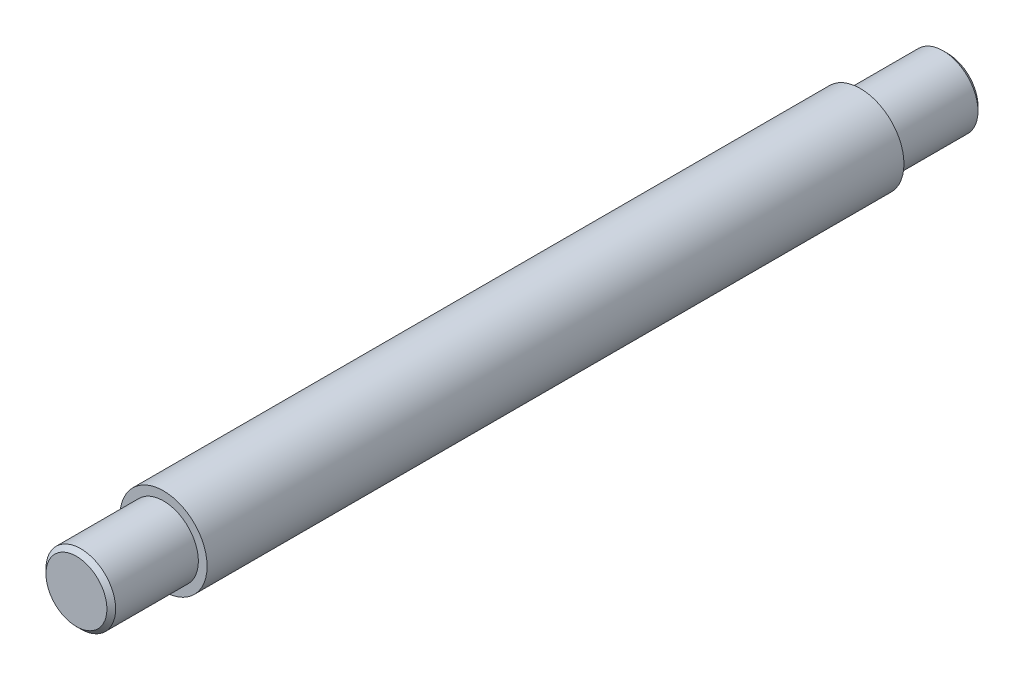
ISO-10303-21;
HEADER;
FILE_DESCRIPTION(('STEP AP214'),'2;1');
FILE_NAME('part.step','',(''),(''),'','','');
FILE_SCHEMA(('AUTOMOTIVE_DESIGN { 1 0 10303 214 1 1 1 1 }'));
ENDSEC;
DATA;
#1=APPLICATION_CONTEXT('core data for automotive mechanical design processes');
#2=APPLICATION_PROTOCOL_DEFINITION('international standard','automotive_design',2000,#1);
#3=PRODUCT_CONTEXT('',#1,'mechanical');
#4=PRODUCT('Part','Part','',(#3));
#5=PRODUCT_RELATED_PRODUCT_CATEGORY('part','',(#4));
#6=PRODUCT_DEFINITION_FORMATION('','',#4);
#7=PRODUCT_DEFINITION_CONTEXT('part definition',#1,'design');
#8=PRODUCT_DEFINITION('design','',#6,#7);
#9=PRODUCT_DEFINITION_SHAPE('','',#8);
#10=(LENGTH_UNIT() NAMED_UNIT(*) SI_UNIT(.MILLI.,.METRE.));
#11=(NAMED_UNIT(*) PLANE_ANGLE_UNIT() SI_UNIT($,.RADIAN.));
#12=(NAMED_UNIT(*) SI_UNIT($,.STERADIAN.) SOLID_ANGLE_UNIT());
#13=UNCERTAINTY_MEASURE_WITH_UNIT(LENGTH_MEASURE(1.E-05),#10,'distance_accuracy_value','');
#14=(GEOMETRIC_REPRESENTATION_CONTEXT(3) GLOBAL_UNCERTAINTY_ASSIGNED_CONTEXT((#13)) GLOBAL_UNIT_ASSIGNED_CONTEXT((#10,
#11,#12)) REPRESENTATION_CONTEXT('',''));
#15=CARTESIAN_POINT('',(0.,0.,0.));
#16=DIRECTION('',(0.,0.,1.));
#17=DIRECTION('',(1.,0.,0.));
#18=AXIS2_PLACEMENT_3D('',#15,#16,#17);
#19=CARTESIAN_POINT('',(0.,0.,10.));
#20=DIRECTION('',(0.,0.,-1.));
#21=DIRECTION('',(-1.,0.,0.));
#22=AXIS2_PLACEMENT_3D('',#19,#20,#21);
#23=CYLINDRICAL_SURFACE('',#22,4.);
#24=CARTESIAN_POINT('',(0.,0.,0.499999999999997));
#25=DIRECTION('',(0.,0.,1.));
#26=DIRECTION('',(1.,0.,0.));
#27=AXIS2_PLACEMENT_3D('',#24,#25,#26);
#28=CIRCLE('',#27,4.);
#29=CARTESIAN_POINT('',(4.,0.,0.499999999999997));
#30=VERTEX_POINT('',#29);
#31=EDGE_CURVE('E49',#30,#30,#28,.T.);
#32=ORIENTED_EDGE('',*,*,#31,.T.);
#33=EDGE_LOOP('',(#32));
#34=FACE_BOUND('',#33,.T.);
#35=CARTESIAN_POINT('',(0.,0.,10.));
#36=DIRECTION('',(0.,0.,1.));
#37=DIRECTION('',(1.,0.,0.));
#38=AXIS2_PLACEMENT_3D('',#35,#36,#37);
#39=CIRCLE('',#38,4.);
#40=CARTESIAN_POINT('',(4.,0.,10.));
#41=VERTEX_POINT('',#40);
#42=EDGE_CURVE('E54',#41,#41,#39,.T.);
#43=ORIENTED_EDGE('',*,*,#42,.F.);
#44=EDGE_LOOP('',(#43));
#45=FACE_BOUND('',#44,.T.);
#46=ADVANCED_FACE('F34',(#34,#45),#23,.T.);
#47=CARTESIAN_POINT('',(0.,0.,0.));
#48=DIRECTION('',(0.,0.,1.));
#49=DIRECTION('',(1.,0.,0.));
#50=AXIS2_PLACEMENT_3D('',#47,#48,#49);
#51=PLANE('',#50);
#52=CARTESIAN_POINT('',(0.,0.,0.));
#53=DIRECTION('',(0.,0.,1.));
#54=DIRECTION('',(1.,0.,0.));
#55=AXIS2_PLACEMENT_3D('',#52,#53,#54);
#56=CIRCLE('',#55,3.50000000000002);
#57=CARTESIAN_POINT('',(3.50000000000002,0.,0.));
#58=VERTEX_POINT('',#57);
#59=EDGE_CURVE('E45',#58,#58,#56,.F.);
#60=ORIENTED_EDGE('',*,*,#59,.T.);
#61=EDGE_LOOP('',(#60));
#62=FACE_BOUND('',#61,.T.);
#63=ADVANCED_FACE('F79',(#62),#51,.F.);
#64=CARTESIAN_POINT('',(0.,0.,90.));
#65=DIRECTION('',(0.,0.,-1.));
#66=DIRECTION('',(-1.,0.,0.));
#67=AXIS2_PLACEMENT_3D('',#64,#65,#66);
#68=CYLINDRICAL_SURFACE('',#67,5.);
#69=CARTESIAN_POINT('',(0.,0.,90.));
#70=DIRECTION('',(0.,0.,1.));
#71=DIRECTION('',(1.,0.,0.));
#72=AXIS2_PLACEMENT_3D('',#69,#70,#71);
#73=CIRCLE('',#72,5.);
#74=CARTESIAN_POINT('',(5.,0.,90.));
#75=VERTEX_POINT('',#74);
#76=EDGE_CURVE('E57',#75,#75,#73,.T.);
#77=ORIENTED_EDGE('',*,*,#76,.F.);
#78=EDGE_LOOP('',(#77));
#79=FACE_BOUND('',#78,.T.);
#80=CARTESIAN_POINT('',(0.,0.,10.));
#81=DIRECTION('',(0.,0.,1.));
#82=DIRECTION('',(1.,0.,0.));
#83=AXIS2_PLACEMENT_3D('',#80,#81,#82);
#84=CIRCLE('',#83,5.);
#85=CARTESIAN_POINT('',(5.,0.,10.));
#86=VERTEX_POINT('',#85);
#87=EDGE_CURVE('E58',#86,#86,#84,.T.);
#88=ORIENTED_EDGE('',*,*,#87,.T.);
#89=EDGE_LOOP('',(#88));
#90=FACE_BOUND('',#89,.T.);
#91=ADVANCED_FACE('F73',(#79,#90),#68,.T.);
#92=CARTESIAN_POINT('',(0.,0.,90.));
#93=DIRECTION('',(0.,0.,1.));
#94=DIRECTION('',(1.,0.,0.));
#95=AXIS2_PLACEMENT_3D('',#92,#93,#94);
#96=PLANE('',#95);
#97=CARTESIAN_POINT('',(0.,0.,90.));
#98=DIRECTION('',(0.,0.,1.));
#99=DIRECTION('',(1.,0.,0.));
#100=AXIS2_PLACEMENT_3D('',#97,#98,#99);
#101=CIRCLE('',#100,4.);
#102=CARTESIAN_POINT('',(4.,0.,90.));
#103=VERTEX_POINT('',#102);
#104=EDGE_CURVE('E61',#103,#103,#101,.T.);
#105=ORIENTED_EDGE('',*,*,#104,.F.);
#106=EDGE_LOOP('',(#105));
#107=FACE_BOUND('',#106,.T.);
#108=ORIENTED_EDGE('',*,*,#76,.T.);
#109=EDGE_LOOP('',(#108));
#110=FACE_BOUND('',#109,.T.);
#111=ADVANCED_FACE('F69',(#107,#110),#96,.T.);
#112=CARTESIAN_POINT('',(0.,0.,10.));
#113=DIRECTION('',(0.,0.,1.));
#114=DIRECTION('',(1.,0.,0.));
#115=AXIS2_PLACEMENT_3D('',#112,#113,#114);
#116=PLANE('',#115);
#117=ORIENTED_EDGE('',*,*,#42,.T.);
#118=EDGE_LOOP('',(#117));
#119=FACE_BOUND('',#118,.T.);
#120=ORIENTED_EDGE('',*,*,#87,.F.);
#121=EDGE_LOOP('',(#120));
#122=FACE_BOUND('',#121,.T.);
#123=ADVANCED_FACE('F72',(#119,#122),#116,.F.);
#124=CARTESIAN_POINT('',(0.,0.,100.));
#125=DIRECTION('',(0.,0.,-1.));
#126=DIRECTION('',(-1.,0.,0.));
#127=AXIS2_PLACEMENT_3D('',#124,#125,#126);
#128=CYLINDRICAL_SURFACE('',#127,4.);
#129=CARTESIAN_POINT('',(0.,0.,99.5));
#130=DIRECTION('',(0.,0.,1.));
#131=DIRECTION('',(1.,0.,0.));
#132=AXIS2_PLACEMENT_3D('',#129,#130,#131);
#133=CIRCLE('',#132,4.);
#134=CARTESIAN_POINT('',(4.,0.,99.5));
#135=VERTEX_POINT('',#134);
#136=EDGE_CURVE('E10',#135,#135,#133,.F.);
#137=ORIENTED_EDGE('',*,*,#136,.T.);
#138=EDGE_LOOP('',(#137));
#139=FACE_BOUND('',#138,.T.);
#140=ORIENTED_EDGE('',*,*,#104,.T.);
#141=EDGE_LOOP('',(#140));
#142=FACE_BOUND('',#141,.T.);
#143=ADVANCED_FACE('F67',(#139,#142),#128,.T.);
#144=CARTESIAN_POINT('',(0.,0.,100.));
#145=DIRECTION('',(0.,0.,1.));
#146=DIRECTION('',(1.,0.,0.));
#147=AXIS2_PLACEMENT_3D('',#144,#145,#146);
#148=PLANE('',#147);
#149=CARTESIAN_POINT('',(0.,0.,100.));
#150=DIRECTION('',(0.,0.,1.));
#151=DIRECTION('',(1.,0.,0.));
#152=AXIS2_PLACEMENT_3D('',#149,#150,#151);
#153=CIRCLE('',#152,3.5);
#154=CARTESIAN_POINT('',(3.5,0.,100.));
#155=VERTEX_POINT('',#154);
#156=EDGE_CURVE('E41',#155,#155,#153,.T.);
#157=ORIENTED_EDGE('',*,*,#156,.T.);
#158=EDGE_LOOP('',(#157));
#159=FACE_BOUND('',#158,.T.);
#160=ADVANCED_FACE('F89',(#159),#148,.T.);
#161=CARTESIAN_POINT('',(0.,0.,0.499999999999997));
#162=DIRECTION('',(0.,0.,1.));
#163=DIRECTION('',(1.,0.,0.));
#164=AXIS2_PLACEMENT_3D('',#161,#162,#163);
#165=CONICAL_SURFACE('',#164,4.,0.785398163397434);
#166=ORIENTED_EDGE('',*,*,#59,.F.);
#167=EDGE_LOOP('',(#166));
#168=FACE_BOUND('',#167,.T.);
#169=ORIENTED_EDGE('',*,*,#31,.F.);
#170=EDGE_LOOP('',(#169));
#171=FACE_BOUND('',#170,.T.);
#172=ADVANCED_FACE('F100',(#168,#171),#165,.T.);
#173=CARTESIAN_POINT('',(0.,0.,100.));
#174=DIRECTION('',(0.,0.,-1.));
#175=DIRECTION('',(-1.,0.,0.));
#176=AXIS2_PLACEMENT_3D('',#173,#174,#175);
#177=CONICAL_SURFACE('',#176,3.5,0.785398163397444);
#178=ORIENTED_EDGE('',*,*,#136,.F.);
#179=EDGE_LOOP('',(#178));
#180=FACE_BOUND('',#179,.T.);
#181=ORIENTED_EDGE('',*,*,#156,.F.);
#182=EDGE_LOOP('',(#181));
#183=FACE_BOUND('',#182,.T.);
#184=ADVANCED_FACE('F36',(#180,#183),#177,.T.);
#185=CLOSED_SHELL('',(#46,#63,#91,#111,#123,#143,#160,#172,#184));
#186=MANIFOLD_SOLID_BREP('B2',#185);
#187=ADVANCED_BREP_SHAPE_REPRESENTATION('',(#18,#186),#14);
#188=SHAPE_DEFINITION_REPRESENTATION(#9,#187);
ENDSEC;
END-ISO-10303-21;
